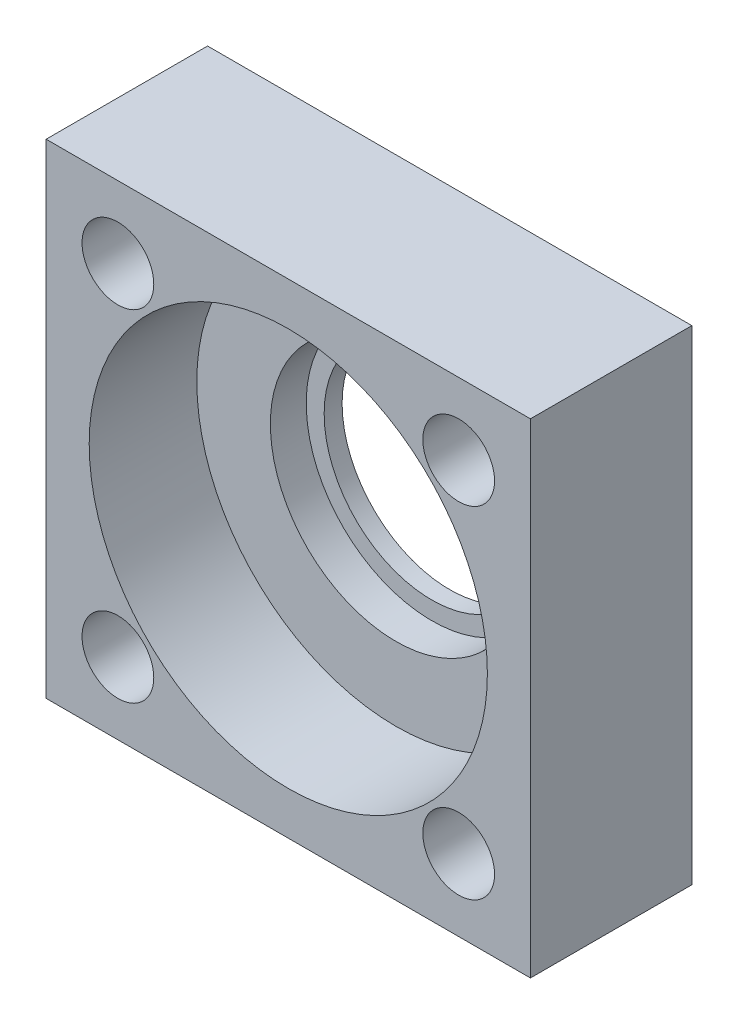
ISO-10303-21;
HEADER;
FILE_DESCRIPTION(('STEP AP214'),'2;1');
FILE_NAME('part.step','',(''),(''),'','','');
FILE_SCHEMA(('AUTOMOTIVE_DESIGN { 1 0 10303 214 1 1 1 1 }'));
ENDSEC;
DATA;
#1=APPLICATION_CONTEXT('core data for automotive mechanical design processes');
#2=APPLICATION_PROTOCOL_DEFINITION('international standard','automotive_design',2000,#1);
#3=PRODUCT_CONTEXT('',#1,'mechanical');
#4=PRODUCT('Part','Part','',(#3));
#5=PRODUCT_RELATED_PRODUCT_CATEGORY('part','',(#4));
#6=PRODUCT_DEFINITION_FORMATION('','',#4);
#7=PRODUCT_DEFINITION_CONTEXT('part definition',#1,'design');
#8=PRODUCT_DEFINITION('design','',#6,#7);
#9=PRODUCT_DEFINITION_SHAPE('','',#8);
#10=(LENGTH_UNIT() NAMED_UNIT(*) SI_UNIT(.MILLI.,.METRE.));
#11=(NAMED_UNIT(*) PLANE_ANGLE_UNIT() SI_UNIT($,.RADIAN.));
#12=(NAMED_UNIT(*) SI_UNIT($,.STERADIAN.) SOLID_ANGLE_UNIT());
#13=UNCERTAINTY_MEASURE_WITH_UNIT(LENGTH_MEASURE(1.E-05),#10,'distance_accuracy_value','');
#14=(GEOMETRIC_REPRESENTATION_CONTEXT(3) GLOBAL_UNCERTAINTY_ASSIGNED_CONTEXT((#13)) GLOBAL_UNIT_ASSIGNED_CONTEXT((#10,
#11,#12)) REPRESENTATION_CONTEXT('',''));
#15=CARTESIAN_POINT('',(0.,0.,0.));
#16=DIRECTION('',(0.,0.,1.));
#17=DIRECTION('',(1.,0.,0.));
#18=AXIS2_PLACEMENT_3D('',#15,#16,#17);
#19=CARTESIAN_POINT('',(0.,0.,0.));
#20=DIRECTION('',(0.,0.,1.));
#21=DIRECTION('',(1.,0.,0.));
#22=AXIS2_PLACEMENT_3D('',#19,#20,#21);
#23=CYLINDRICAL_SURFACE('',#22,30.);
#24=CARTESIAN_POINT('',(0.,0.,0.));
#25=DIRECTION('',(0.,0.,1.));
#26=DIRECTION('',(1.,0.,0.));
#27=AXIS2_PLACEMENT_3D('',#24,#25,#26);
#28=CIRCLE('',#27,30.);
#29=CARTESIAN_POINT('',(30.,0.,0.));
#30=VERTEX_POINT('',#29);
#31=EDGE_CURVE('E145',#30,#30,#28,.T.);
#32=CARTESIAN_POINT('',(0.,0.,5.));
#33=DIRECTION('',(0.,0.,1.));
#34=DIRECTION('',(1.,0.,0.));
#35=AXIS2_PLACEMENT_3D('',#32,#33,#34);
#36=CIRCLE('',#35,30.);
#37=CARTESIAN_POINT('',(30.,0.,5.));
#38=VERTEX_POINT('',#37);
#39=EDGE_CURVE('E49',#38,#38,#36,.F.);
#40=CARTESIAN_POINT('',(30.,0.,0.));
#41=CARTESIAN_POINT('',(30.,0.,0.0520833333333332));
#42=CARTESIAN_POINT('',(30.,0.,0.104166666666667));
#43=CARTESIAN_POINT('',(30.,0.,0.208333333333333));
#44=CARTESIAN_POINT('',(30.,0.,0.260416666666667));
#45=CARTESIAN_POINT('',(30.,0.,0.364583333333333));
#46=CARTESIAN_POINT('',(30.,0.,0.416666666666667));
#47=CARTESIAN_POINT('',(30.,0.,0.520833333333333));
#48=CARTESIAN_POINT('',(30.,0.,0.572916666666666));
#49=CARTESIAN_POINT('',(30.,0.,0.677083333333333));
#50=CARTESIAN_POINT('',(30.,0.,0.729166666666666));
#51=CARTESIAN_POINT('',(30.,0.,0.833333333333333));
#52=CARTESIAN_POINT('',(30.,0.,0.885416666666666));
#53=CARTESIAN_POINT('',(30.,0.,0.989583333333333));
#54=CARTESIAN_POINT('',(30.,0.,1.04166666666667));
#55=CARTESIAN_POINT('',(30.,0.,1.14583333333333));
#56=CARTESIAN_POINT('',(30.,0.,1.19791666666667));
#57=CARTESIAN_POINT('',(30.,0.,1.30208333333333));
#58=CARTESIAN_POINT('',(30.,0.,1.35416666666667));
#59=CARTESIAN_POINT('',(30.,0.,1.45833333333333));
#60=CARTESIAN_POINT('',(30.,0.,1.51041666666667));
#61=CARTESIAN_POINT('',(30.,0.,1.61458333333333));
#62=CARTESIAN_POINT('',(30.,0.,1.66666666666667));
#63=CARTESIAN_POINT('',(30.,0.,1.77083333333333));
#64=CARTESIAN_POINT('',(30.,0.,1.82291666666667));
#65=CARTESIAN_POINT('',(30.,0.,1.92708333333333));
#66=CARTESIAN_POINT('',(30.,0.,1.97916666666667));
#67=CARTESIAN_POINT('',(30.,0.,2.08333333333333));
#68=CARTESIAN_POINT('',(30.,0.,2.13541666666667));
#69=CARTESIAN_POINT('',(30.,0.,2.23958333333333));
#70=CARTESIAN_POINT('',(30.,0.,2.29166666666667));
#71=CARTESIAN_POINT('',(30.,0.,2.39583333333333));
#72=CARTESIAN_POINT('',(30.,0.,2.44791666666667));
#73=CARTESIAN_POINT('',(30.,0.,2.55208333333333));
#74=CARTESIAN_POINT('',(30.,0.,2.60416666666667));
#75=CARTESIAN_POINT('',(30.,0.,2.70833333333333));
#76=CARTESIAN_POINT('',(30.,0.,2.76041666666667));
#77=CARTESIAN_POINT('',(30.,0.,2.86458333333333));
#78=CARTESIAN_POINT('',(30.,0.,2.91666666666667));
#79=CARTESIAN_POINT('',(30.,0.,3.02083333333333));
#80=CARTESIAN_POINT('',(30.,0.,3.07291666666667));
#81=CARTESIAN_POINT('',(30.,0.,3.17708333333333));
#82=CARTESIAN_POINT('',(30.,0.,3.22916666666667));
#83=CARTESIAN_POINT('',(30.,0.,3.33333333333333));
#84=CARTESIAN_POINT('',(30.,0.,3.38541666666667));
#85=CARTESIAN_POINT('',(30.,0.,3.48958333333333));
#86=CARTESIAN_POINT('',(30.,0.,3.54166666666667));
#87=CARTESIAN_POINT('',(30.,0.,3.64583333333333));
#88=CARTESIAN_POINT('',(30.,0.,3.69791666666667));
#89=CARTESIAN_POINT('',(30.,0.,3.80208333333333));
#90=CARTESIAN_POINT('',(30.,0.,3.85416666666667));
#91=CARTESIAN_POINT('',(30.,0.,3.95833333333333));
#92=CARTESIAN_POINT('',(30.,0.,4.01041666666667));
#93=CARTESIAN_POINT('',(30.,0.,4.11458333333333));
#94=CARTESIAN_POINT('',(30.,0.,4.16666666666667));
#95=CARTESIAN_POINT('',(30.,0.,4.27083333333333));
#96=CARTESIAN_POINT('',(30.,0.,4.32291666666667));
#97=CARTESIAN_POINT('',(30.,0.,4.42708333333333));
#98=CARTESIAN_POINT('',(30.,0.,4.47916666666667));
#99=CARTESIAN_POINT('',(30.,0.,4.58333333333333));
#100=CARTESIAN_POINT('',(30.,0.,4.63541666666667));
#101=CARTESIAN_POINT('',(30.,0.,4.73958333333333));
#102=CARTESIAN_POINT('',(30.,0.,4.79166666666666));
#103=CARTESIAN_POINT('',(30.,0.,4.89583333333333));
#104=CARTESIAN_POINT('',(30.,0.,4.94791666666666));
#105=CARTESIAN_POINT('',(30.,0.,5.));
#106=B_SPLINE_CURVE_WITH_KNOTS('',3,(#40,#41,#42,#43,#44,#45,#46,#47,#48,#49,#50,#51,#52,#53,
#54,#55,#56,#57,#58,#59,#60,#61,#62,#63,#64,#65,#66,#67,#68,#69,#70,#71,#72,#73,#74,#75,#76,#77,
#78,#79,#80,#81,#82,#83,#84,#85,#86,#87,#88,#89,#90,#91,#92,#93,#94,#95,#96,#97,#98,#99,#100,
#101,#102,#103,#104,#105),.UNSPECIFIED.,.F.,.F.,(4,2,2,2,2,2,2,2,2,2,2,2,2,2,2,2,2,2,2,2,2,2,2,
2,2,2,2,2,2,2,2,2,4),(0.,0.15625,0.3125,0.46875,0.625,0.78125,0.9375,1.09375,1.25,1.40625,
1.5625,1.71875,1.875,2.03125,2.1875,2.34375,2.5,2.65625,2.8125,2.96875,3.125,3.28125,3.4375,
3.59375,3.75,3.90625,4.0625,4.21875,4.375,4.53125,4.6875,4.84375,5.),.UNSPECIFIED.);
#107=EDGE_CURVE('BSEAM45',#30,#38,#106,.T.);
#108=ORIENTED_EDGE('',*,*,#31,.F.);
#109=ORIENTED_EDGE('',*,*,#39,.F.);
#110=ORIENTED_EDGE('',*,*,#107,.T.);
#111=ORIENTED_EDGE('',*,*,#107,.F.);
#112=EDGE_LOOP('',(#108,#110,#109,#111));
#113=FACE_BOUND('',#112,.T.);
#114=ADVANCED_FACE('F45',(#113),#23,.F.);
#115=CARTESIAN_POINT('',(67.5,-67.5,45.));
#116=DIRECTION('',(-1.,0.,0.));
#117=DIRECTION('',(0.,0.,1.));
#118=AXIS2_PLACEMENT_3D('',#115,#116,#117);
#119=PLANE('',#118);
#120=DIRECTION('',(0.,1.,0.));
#121=VECTOR('',#120,1.);
#122=CARTESIAN_POINT('',(67.5,-67.5,0.));
#123=LINE('',#122,#121);
#124=CARTESIAN_POINT('',(67.5,-67.5,0.));
#125=VERTEX_POINT('',#124);
#126=CARTESIAN_POINT('',(67.5,67.5,0.));
#127=VERTEX_POINT('',#126);
#128=EDGE_CURVE('E116',#125,#127,#123,.T.);
#129=ORIENTED_EDGE('',*,*,#128,.T.);
#130=DIRECTION('',(0.,0.,-1.));
#131=VECTOR('',#130,1.);
#132=CARTESIAN_POINT('',(67.5,67.5,45.));
#133=LINE('',#132,#131);
#134=CARTESIAN_POINT('',(67.5,67.5,45.));
#135=VERTEX_POINT('',#134);
#136=EDGE_CURVE('E11',#135,#127,#133,.T.);
#137=ORIENTED_EDGE('',*,*,#136,.F.);
#138=DIRECTION('',(0.,1.,0.));
#139=VECTOR('',#138,1.);
#140=CARTESIAN_POINT('',(67.5,-67.5,45.));
#141=LINE('',#140,#139);
#142=CARTESIAN_POINT('',(67.5,-67.5,45.));
#143=VERTEX_POINT('',#142);
#144=EDGE_CURVE('E99',#143,#135,#141,.T.);
#145=ORIENTED_EDGE('',*,*,#144,.F.);
#146=DIRECTION('',(0.,0.,-1.));
#147=VECTOR('',#146,1.);
#148=CARTESIAN_POINT('',(67.5,-67.5,45.));
#149=LINE('',#148,#147);
#150=EDGE_CURVE('E112',#143,#125,#149,.T.);
#151=ORIENTED_EDGE('',*,*,#150,.T.);
#152=EDGE_LOOP('',(#129,#137,#145,#151));
#153=FACE_BOUND('',#152,.T.);
#154=ADVANCED_FACE('F47',(#153),#119,.F.);
#155=CARTESIAN_POINT('',(-67.5,67.5,45.));
#156=DIRECTION('',(0.,-1.,0.));
#157=DIRECTION('',(0.,0.,-1.));
#158=AXIS2_PLACEMENT_3D('',#155,#156,#157);
#159=PLANE('',#158);
#160=DIRECTION('',(-1.,0.,0.));
#161=VECTOR('',#160,1.);
#162=CARTESIAN_POINT('',(-67.5,67.5,0.));
#163=LINE('',#162,#161);
#164=CARTESIAN_POINT('',(-67.5,67.5,0.));
#165=VERTEX_POINT('',#164);
#166=EDGE_CURVE('E104',#127,#165,#163,.T.);
#167=ORIENTED_EDGE('',*,*,#166,.T.);
#168=DIRECTION('',(0.,0.,-1.));
#169=VECTOR('',#168,1.);
#170=CARTESIAN_POINT('',(-67.5,67.5,45.));
#171=LINE('',#170,#169);
#172=CARTESIAN_POINT('',(-67.5,67.5,45.));
#173=VERTEX_POINT('',#172);
#174=EDGE_CURVE('E56',#173,#165,#171,.T.);
#175=ORIENTED_EDGE('',*,*,#174,.F.);
#176=DIRECTION('',(-1.,0.,0.));
#177=VECTOR('',#176,1.);
#178=CARTESIAN_POINT('',(-67.5,67.5,45.));
#179=LINE('',#178,#177);
#180=EDGE_CURVE('E94',#135,#173,#179,.T.);
#181=ORIENTED_EDGE('',*,*,#180,.F.);
#182=ORIENTED_EDGE('',*,*,#136,.T.);
#183=EDGE_LOOP('',(#167,#175,#181,#182));
#184=FACE_BOUND('',#183,.T.);
#185=ADVANCED_FACE('F103',(#184),#159,.F.);
#186=CARTESIAN_POINT('',(-67.5,-67.5,45.));
#187=DIRECTION('',(1.,0.,0.));
#188=DIRECTION('',(0.,0.,-1.));
#189=AXIS2_PLACEMENT_3D('',#186,#187,#188);
#190=PLANE('',#189);
#191=DIRECTION('',(0.,-1.,0.));
#192=VECTOR('',#191,1.);
#193=CARTESIAN_POINT('',(-67.5,-67.5,0.));
#194=LINE('',#193,#192);
#195=CARTESIAN_POINT('',(-67.5,-67.5,0.));
#196=VERTEX_POINT('',#195);
#197=EDGE_CURVE('E81',#165,#196,#194,.T.);
#198=ORIENTED_EDGE('',*,*,#197,.T.);
#199=DIRECTION('',(0.,0.,-1.));
#200=VECTOR('',#199,1.);
#201=CARTESIAN_POINT('',(-67.5,-67.5,45.));
#202=LINE('',#201,#200);
#203=CARTESIAN_POINT('',(-67.5,-67.5,45.));
#204=VERTEX_POINT('',#203);
#205=EDGE_CURVE('E106',#204,#196,#202,.T.);
#206=ORIENTED_EDGE('',*,*,#205,.F.);
#207=DIRECTION('',(0.,-1.,0.));
#208=VECTOR('',#207,1.);
#209=CARTESIAN_POINT('',(-67.5,-67.5,45.));
#210=LINE('',#209,#208);
#211=EDGE_CURVE('E97',#173,#204,#210,.T.);
#212=ORIENTED_EDGE('',*,*,#211,.F.);
#213=ORIENTED_EDGE('',*,*,#174,.T.);
#214=EDGE_LOOP('',(#198,#206,#212,#213));
#215=FACE_BOUND('',#214,.T.);
#216=ADVANCED_FACE('F108',(#215),#190,.F.);
#217=CARTESIAN_POINT('',(-67.5,-67.5,45.));
#218=DIRECTION('',(0.,1.,0.));
#219=DIRECTION('',(0.,0.,1.));
#220=AXIS2_PLACEMENT_3D('',#217,#218,#219);
#221=PLANE('',#220);
#222=DIRECTION('',(1.,0.,0.));
#223=VECTOR('',#222,1.);
#224=CARTESIAN_POINT('',(-67.5,-67.5,0.));
#225=LINE('',#224,#223);
#226=EDGE_CURVE('E87',#196,#125,#225,.T.);
#227=ORIENTED_EDGE('',*,*,#226,.T.);
#228=ORIENTED_EDGE('',*,*,#150,.F.);
#229=DIRECTION('',(1.,0.,0.));
#230=VECTOR('',#229,1.);
#231=CARTESIAN_POINT('',(-67.5,-67.5,45.));
#232=LINE('',#231,#230);
#233=EDGE_CURVE('E64',#204,#143,#232,.T.);
#234=ORIENTED_EDGE('',*,*,#233,.F.);
#235=ORIENTED_EDGE('',*,*,#205,.T.);
#236=EDGE_LOOP('',(#227,#228,#234,#235));
#237=FACE_BOUND('',#236,.T.);
#238=ADVANCED_FACE('F130',(#237),#221,.F.);
#239=CARTESIAN_POINT('',(0.,0.,45.));
#240=DIRECTION('',(0.,0.,-1.));
#241=DIRECTION('',(-1.,0.,0.));
#242=AXIS2_PLACEMENT_3D('',#239,#240,#241);
#243=PLANE('',#242);
#244=CARTESIAN_POINT('',(0.,0.,45.));
#245=DIRECTION('',(0.,0.,1.));
#246=DIRECTION('',(1.,0.,0.));
#247=AXIS2_PLACEMENT_3D('',#244,#245,#246);
#248=CIRCLE('',#247,55.5);
#249=CARTESIAN_POINT('',(55.5,0.,45.));
#250=VERTEX_POINT('',#249);
#251=EDGE_CURVE('E173',#250,#250,#248,.T.);
#252=ORIENTED_EDGE('',*,*,#251,.F.);
#253=EDGE_LOOP('',(#252));
#254=FACE_BOUND('',#253,.T.);
#255=CARTESIAN_POINT('',(-47.5,-47.5,45.));
#256=DIRECTION('',(0.,0.,1.));
#257=DIRECTION('',(-1.,0.,0.));
#258=AXIS2_PLACEMENT_3D('',#255,#256,#257);
#259=CIRCLE('',#258,10.);
#260=CARTESIAN_POINT('',(-37.5,-47.5,45.));
#261=VERTEX_POINT('',#260);
#262=EDGE_CURVE('E154',#261,#261,#259,.T.);
#263=ORIENTED_EDGE('',*,*,#262,.F.);
#264=EDGE_LOOP('',(#263));
#265=FACE_BOUND('',#264,.T.);
#266=CARTESIAN_POINT('',(47.5,-47.5,45.));
#267=DIRECTION('',(0.,0.,1.));
#268=DIRECTION('',(1.,0.,0.));
#269=AXIS2_PLACEMENT_3D('',#266,#267,#268);
#270=CIRCLE('',#269,10.);
#271=CARTESIAN_POINT('',(57.5,-47.5,45.));
#272=VERTEX_POINT('',#271);
#273=EDGE_CURVE('E162',#272,#272,#270,.T.);
#274=ORIENTED_EDGE('',*,*,#273,.F.);
#275=EDGE_LOOP('',(#274));
#276=FACE_BOUND('',#275,.T.);
#277=CARTESIAN_POINT('',(47.5,47.5,45.));
#278=DIRECTION('',(0.,0.,1.));
#279=DIRECTION('',(-1.,0.,0.));
#280=AXIS2_PLACEMENT_3D('',#277,#278,#279);
#281=CIRCLE('',#280,10.);
#282=CARTESIAN_POINT('',(57.5,47.5,45.));
#283=VERTEX_POINT('',#282);
#284=EDGE_CURVE('E141',#283,#283,#281,.T.);
#285=ORIENTED_EDGE('',*,*,#284,.F.);
#286=EDGE_LOOP('',(#285));
#287=FACE_BOUND('',#286,.T.);
#288=CARTESIAN_POINT('',(-47.5,47.5,45.));
#289=DIRECTION('',(0.,0.,1.));
#290=DIRECTION('',(1.,0.,0.));
#291=AXIS2_PLACEMENT_3D('',#288,#289,#290);
#292=CIRCLE('',#291,10.);
#293=CARTESIAN_POINT('',(-37.5,47.5,45.));
#294=VERTEX_POINT('',#293);
#295=EDGE_CURVE('E137',#294,#294,#292,.T.);
#296=ORIENTED_EDGE('',*,*,#295,.F.);
#297=EDGE_LOOP('',(#296));
#298=FACE_BOUND('',#297,.T.);
#299=ORIENTED_EDGE('',*,*,#144,.T.);
#300=ORIENTED_EDGE('',*,*,#180,.T.);
#301=ORIENTED_EDGE('',*,*,#211,.T.);
#302=ORIENTED_EDGE('',*,*,#233,.T.);
#303=EDGE_LOOP('',(#299,#300,#301,#302));
#304=FACE_BOUND('',#303,.T.);
#305=ADVANCED_FACE('F95',(#254,#265,#276,#287,#298,#304),#243,.F.);
#306=CARTESIAN_POINT('',(0.,0.,0.));
#307=DIRECTION('',(0.,0.,-1.));
#308=DIRECTION('',(-1.,0.,0.));
#309=AXIS2_PLACEMENT_3D('',#306,#307,#308);
#310=PLANE('',#309);
#311=ORIENTED_EDGE('',*,*,#31,.T.);
#312=EDGE_LOOP('',(#311));
#313=FACE_BOUND('',#312,.T.);
#314=CARTESIAN_POINT('',(-47.5,-47.5,0.));
#315=DIRECTION('',(0.,0.,1.));
#316=DIRECTION('',(-1.,0.,0.));
#317=AXIS2_PLACEMENT_3D('',#314,#315,#316);
#318=CIRCLE('',#317,10.);
#319=CARTESIAN_POINT('',(-37.5,-47.5,0.));
#320=VERTEX_POINT('',#319);
#321=EDGE_CURVE('E149',#320,#320,#318,.T.);
#322=ORIENTED_EDGE('',*,*,#321,.T.);
#323=EDGE_LOOP('',(#322));
#324=FACE_BOUND('',#323,.T.);
#325=CARTESIAN_POINT('',(47.5,-47.5,0.));
#326=DIRECTION('',(0.,0.,1.));
#327=DIRECTION('',(1.,0.,0.));
#328=AXIS2_PLACEMENT_3D('',#325,#326,#327);
#329=CIRCLE('',#328,10.);
#330=CARTESIAN_POINT('',(57.5,-47.5,0.));
#331=VERTEX_POINT('',#330);
#332=EDGE_CURVE('E158',#331,#331,#329,.T.);
#333=ORIENTED_EDGE('',*,*,#332,.T.);
#334=EDGE_LOOP('',(#333));
#335=FACE_BOUND('',#334,.T.);
#336=CARTESIAN_POINT('',(47.5,47.5,0.));
#337=DIRECTION('',(0.,0.,1.));
#338=DIRECTION('',(-1.,0.,0.));
#339=AXIS2_PLACEMENT_3D('',#336,#337,#338);
#340=CIRCLE('',#339,10.);
#341=CARTESIAN_POINT('',(57.5,47.5,0.));
#342=VERTEX_POINT('',#341);
#343=EDGE_CURVE('E166',#342,#342,#340,.T.);
#344=ORIENTED_EDGE('',*,*,#343,.T.);
#345=EDGE_LOOP('',(#344));
#346=FACE_BOUND('',#345,.T.);
#347=CARTESIAN_POINT('',(-47.5,47.5,0.));
#348=DIRECTION('',(0.,0.,1.));
#349=DIRECTION('',(1.,0.,0.));
#350=AXIS2_PLACEMENT_3D('',#347,#348,#349);
#351=CIRCLE('',#350,10.);
#352=CARTESIAN_POINT('',(-37.5,47.5,0.));
#353=VERTEX_POINT('',#352);
#354=EDGE_CURVE('E120',#353,#353,#351,.T.);
#355=ORIENTED_EDGE('',*,*,#354,.T.);
#356=EDGE_LOOP('',(#355));
#357=FACE_BOUND('',#356,.T.);
#358=ORIENTED_EDGE('',*,*,#128,.F.);
#359=ORIENTED_EDGE('',*,*,#226,.F.);
#360=ORIENTED_EDGE('',*,*,#197,.F.);
#361=ORIENTED_EDGE('',*,*,#166,.F.);
#362=EDGE_LOOP('',(#358,#359,#360,#361));
#363=FACE_BOUND('',#362,.T.);
#364=ADVANCED_FACE('F133',(#313,#324,#335,#346,#357,#363),#310,.T.);
#365=CARTESIAN_POINT('',(-47.5,47.5,0.));
#366=DIRECTION('',(0.,0.,1.));
#367=DIRECTION('',(1.,0.,0.));
#368=AXIS2_PLACEMENT_3D('',#365,#366,#367);
#369=CYLINDRICAL_SURFACE('',#368,10.);
#370=CARTESIAN_POINT('',(-37.5,47.5,0.));
#371=CARTESIAN_POINT('',(-37.5,47.5,0.468749999999999));
#372=CARTESIAN_POINT('',(-37.5,47.5,0.9375));
#373=CARTESIAN_POINT('',(-37.5,47.5,1.875));
#374=CARTESIAN_POINT('',(-37.5,47.5,2.34375));
#375=CARTESIAN_POINT('',(-37.5,47.5,3.28125));
#376=CARTESIAN_POINT('',(-37.5,47.5,3.75));
#377=CARTESIAN_POINT('',(-37.5,47.5,4.6875));
#378=CARTESIAN_POINT('',(-37.5,47.5,5.15625));
#379=CARTESIAN_POINT('',(-37.5,47.5,6.09375));
#380=CARTESIAN_POINT('',(-37.5,47.5,6.5625));
#381=CARTESIAN_POINT('',(-37.5,47.5,7.5));
#382=CARTESIAN_POINT('',(-37.5,47.5,7.96875));
#383=CARTESIAN_POINT('',(-37.5,47.5,8.90625));
#384=CARTESIAN_POINT('',(-37.5,47.5,9.375));
#385=CARTESIAN_POINT('',(-37.5,47.5,10.3125));
#386=CARTESIAN_POINT('',(-37.5,47.5,10.78125));
#387=CARTESIAN_POINT('',(-37.5,47.5,11.71875));
#388=CARTESIAN_POINT('',(-37.5,47.5,12.1875));
#389=CARTESIAN_POINT('',(-37.5,47.5,13.125));
#390=CARTESIAN_POINT('',(-37.5,47.5,13.59375));
#391=CARTESIAN_POINT('',(-37.5,47.5,14.53125));
#392=CARTESIAN_POINT('',(-37.5,47.5,15.));
#393=CARTESIAN_POINT('',(-37.5,47.5,15.9375));
#394=CARTESIAN_POINT('',(-37.5,47.5,16.40625));
#395=CARTESIAN_POINT('',(-37.5,47.5,17.34375));
#396=CARTESIAN_POINT('',(-37.5,47.5,17.8125));
#397=CARTESIAN_POINT('',(-37.5,47.5,18.75));
#398=CARTESIAN_POINT('',(-37.5,47.5,19.21875));
#399=CARTESIAN_POINT('',(-37.5,47.5,20.15625));
#400=CARTESIAN_POINT('',(-37.5,47.5,20.625));
#401=CARTESIAN_POINT('',(-37.5,47.5,21.5625));
#402=CARTESIAN_POINT('',(-37.5,47.5,22.03125));
#403=CARTESIAN_POINT('',(-37.5,47.5,22.96875));
#404=CARTESIAN_POINT('',(-37.5,47.5,23.4375));
#405=CARTESIAN_POINT('',(-37.5,47.5,24.375));
#406=CARTESIAN_POINT('',(-37.5,47.5,24.84375));
#407=CARTESIAN_POINT('',(-37.5,47.5,25.78125));
#408=CARTESIAN_POINT('',(-37.5,47.5,26.25));
#409=CARTESIAN_POINT('',(-37.5,47.5,27.1875));
#410=CARTESIAN_POINT('',(-37.5,47.5,27.65625));
#411=CARTESIAN_POINT('',(-37.5,47.5,28.59375));
#412=CARTESIAN_POINT('',(-37.5,47.5,29.0625));
#413=CARTESIAN_POINT('',(-37.5,47.5,30.));
#414=CARTESIAN_POINT('',(-37.5,47.5,30.46875));
#415=CARTESIAN_POINT('',(-37.5,47.5,31.40625));
#416=CARTESIAN_POINT('',(-37.5,47.5,31.875));
#417=CARTESIAN_POINT('',(-37.5,47.5,32.8125));
#418=CARTESIAN_POINT('',(-37.5,47.5,33.28125));
#419=CARTESIAN_POINT('',(-37.5,47.5,34.21875));
#420=CARTESIAN_POINT('',(-37.5,47.5,34.6875));
#421=CARTESIAN_POINT('',(-37.5,47.5,35.625));
#422=CARTESIAN_POINT('',(-37.5,47.5,36.09375));
#423=CARTESIAN_POINT('',(-37.5,47.5,37.03125));
#424=CARTESIAN_POINT('',(-37.5,47.5,37.5));
#425=CARTESIAN_POINT('',(-37.5,47.5,38.4375));
#426=CARTESIAN_POINT('',(-37.5,47.5,38.90625));
#427=CARTESIAN_POINT('',(-37.5,47.5,39.84375));
#428=CARTESIAN_POINT('',(-37.5,47.5,40.3125));
#429=CARTESIAN_POINT('',(-37.5,47.5,41.25));
#430=CARTESIAN_POINT('',(-37.5,47.5,41.71875));
#431=CARTESIAN_POINT('',(-37.5,47.5,42.65625));
#432=CARTESIAN_POINT('',(-37.5,47.5,43.125));
#433=CARTESIAN_POINT('',(-37.5,47.5,44.0625));
#434=CARTESIAN_POINT('',(-37.5,47.5,44.53125));
#435=CARTESIAN_POINT('',(-37.5,47.5,45.));
#436=B_SPLINE_CURVE_WITH_KNOTS('',3,(#370,#371,#372,#373,#374,#375,#376,#377,#378,#379,#380,
#381,#382,#383,#384,#385,#386,#387,#388,#389,#390,#391,#392,#393,#394,#395,#396,#397,#398,#399,
#400,#401,#402,#403,#404,#405,#406,#407,#408,#409,#410,#411,#412,#413,#414,#415,#416,#417,#418,
#419,#420,#421,#422,#423,#424,#425,#426,#427,#428,#429,#430,#431,#432,#433,#434,#435),
.UNSPECIFIED.,.F.,.F.,(4,2,2,2,2,2,2,2,2,2,2,2,2,2,2,2,2,2,2,2,2,2,2,2,2,2,2,2,2,2,2,2,4),(0.,
1.40625,2.8125,4.21875,5.625,7.03125,8.4375,9.84375,11.25,12.65625,14.0625,15.46875,16.875,
18.28125,19.6875,21.09375,22.5,23.90625,25.3125,26.71875,28.125,29.53125,30.9375,32.34375,33.75,
35.15625,36.5625,37.96875,39.375,40.78125,42.1875,43.59375,45.),.UNSPECIFIED.);
#437=EDGE_CURVE('BSEAM208',#353,#294,#436,.T.);
#438=ORIENTED_EDGE('',*,*,#354,.F.);
#439=ORIENTED_EDGE('',*,*,#295,.T.);
#440=ORIENTED_EDGE('',*,*,#437,.T.);
#441=ORIENTED_EDGE('',*,*,#437,.F.);
#442=EDGE_LOOP('',(#438,#440,#439,#441));
#443=FACE_BOUND('',#442,.T.);
#444=ADVANCED_FACE('F208',(#443),#369,.F.);
#445=CARTESIAN_POINT('',(47.5,47.5,0.));
#446=DIRECTION('',(0.,0.,1.));
#447=DIRECTION('',(1.,0.,0.));
#448=AXIS2_PLACEMENT_3D('',#445,#446,#447);
#449=CYLINDRICAL_SURFACE('',#448,10.);
#450=CARTESIAN_POINT('',(57.5,47.5,0.));
#451=CARTESIAN_POINT('',(57.5,47.5,0.468749999999999));
#452=CARTESIAN_POINT('',(57.5,47.5,0.9375));
#453=CARTESIAN_POINT('',(57.5,47.5,1.875));
#454=CARTESIAN_POINT('',(57.5,47.5,2.34375));
#455=CARTESIAN_POINT('',(57.5,47.5,3.28125));
#456=CARTESIAN_POINT('',(57.5,47.5,3.75));
#457=CARTESIAN_POINT('',(57.5,47.5,4.6875));
#458=CARTESIAN_POINT('',(57.5,47.5,5.15625));
#459=CARTESIAN_POINT('',(57.5,47.5,6.09375));
#460=CARTESIAN_POINT('',(57.5,47.5,6.5625));
#461=CARTESIAN_POINT('',(57.5,47.5,7.5));
#462=CARTESIAN_POINT('',(57.5,47.5,7.96875));
#463=CARTESIAN_POINT('',(57.5,47.5,8.90625));
#464=CARTESIAN_POINT('',(57.5,47.5,9.375));
#465=CARTESIAN_POINT('',(57.5,47.5,10.3125));
#466=CARTESIAN_POINT('',(57.5,47.5,10.78125));
#467=CARTESIAN_POINT('',(57.5,47.5,11.71875));
#468=CARTESIAN_POINT('',(57.5,47.5,12.1875));
#469=CARTESIAN_POINT('',(57.5,47.5,13.125));
#470=CARTESIAN_POINT('',(57.5,47.5,13.59375));
#471=CARTESIAN_POINT('',(57.5,47.5,14.53125));
#472=CARTESIAN_POINT('',(57.5,47.5,15.));
#473=CARTESIAN_POINT('',(57.5,47.5,15.9375));
#474=CARTESIAN_POINT('',(57.5,47.5,16.40625));
#475=CARTESIAN_POINT('',(57.5,47.5,17.34375));
#476=CARTESIAN_POINT('',(57.5,47.5,17.8125));
#477=CARTESIAN_POINT('',(57.5,47.5,18.75));
#478=CARTESIAN_POINT('',(57.5,47.5,19.21875));
#479=CARTESIAN_POINT('',(57.5,47.5,20.15625));
#480=CARTESIAN_POINT('',(57.5,47.5,20.625));
#481=CARTESIAN_POINT('',(57.5,47.5,21.5625));
#482=CARTESIAN_POINT('',(57.5,47.5,22.03125));
#483=CARTESIAN_POINT('',(57.5,47.5,22.96875));
#484=CARTESIAN_POINT('',(57.5,47.5,23.4375));
#485=CARTESIAN_POINT('',(57.5,47.5,24.375));
#486=CARTESIAN_POINT('',(57.5,47.5,24.84375));
#487=CARTESIAN_POINT('',(57.5,47.5,25.78125));
#488=CARTESIAN_POINT('',(57.5,47.5,26.25));
#489=CARTESIAN_POINT('',(57.5,47.5,27.1875));
#490=CARTESIAN_POINT('',(57.5,47.5,27.65625));
#491=CARTESIAN_POINT('',(57.5,47.5,28.59375));
#492=CARTESIAN_POINT('',(57.5,47.5,29.0625));
#493=CARTESIAN_POINT('',(57.5,47.5,30.));
#494=CARTESIAN_POINT('',(57.5,47.5,30.46875));
#495=CARTESIAN_POINT('',(57.5,47.5,31.40625));
#496=CARTESIAN_POINT('',(57.5,47.5,31.875));
#497=CARTESIAN_POINT('',(57.5,47.5,32.8125));
#498=CARTESIAN_POINT('',(57.5,47.5,33.28125));
#499=CARTESIAN_POINT('',(57.5,47.5,34.21875));
#500=CARTESIAN_POINT('',(57.5,47.5,34.6875));
#501=CARTESIAN_POINT('',(57.5,47.5,35.625));
#502=CARTESIAN_POINT('',(57.5,47.5,36.09375));
#503=CARTESIAN_POINT('',(57.5,47.5,37.03125));
#504=CARTESIAN_POINT('',(57.5,47.5,37.5));
#505=CARTESIAN_POINT('',(57.5,47.5,38.4375));
#506=CARTESIAN_POINT('',(57.5,47.5,38.90625));
#507=CARTESIAN_POINT('',(57.5,47.5,39.84375));
#508=CARTESIAN_POINT('',(57.5,47.5,40.3125));
#509=CARTESIAN_POINT('',(57.5,47.5,41.25));
#510=CARTESIAN_POINT('',(57.5,47.5,41.71875));
#511=CARTESIAN_POINT('',(57.5,47.5,42.65625));
#512=CARTESIAN_POINT('',(57.5,47.5,43.125));
#513=CARTESIAN_POINT('',(57.5,47.5,44.0625));
#514=CARTESIAN_POINT('',(57.5,47.5,44.53125));
#515=CARTESIAN_POINT('',(57.5,47.5,45.));
#516=B_SPLINE_CURVE_WITH_KNOTS('',3,(#450,#451,#452,#453,#454,#455,#456,#457,#458,#459,#460,
#461,#462,#463,#464,#465,#466,#467,#468,#469,#470,#471,#472,#473,#474,#475,#476,#477,#478,#479,
#480,#481,#482,#483,#484,#485,#486,#487,#488,#489,#490,#491,#492,#493,#494,#495,#496,#497,#498,
#499,#500,#501,#502,#503,#504,#505,#506,#507,#508,#509,#510,#511,#512,#513,#514,#515),
.UNSPECIFIED.,.F.,.F.,(4,2,2,2,2,2,2,2,2,2,2,2,2,2,2,2,2,2,2,2,2,2,2,2,2,2,2,2,2,2,2,2,4),(0.,
1.40625,2.8125,4.21875,5.625,7.03125,8.4375,9.84375,11.25,12.65625,14.0625,15.46875,16.875,
18.28125,19.6875,21.09375,22.5,23.90625,25.3125,26.71875,28.125,29.53125,30.9375,32.34375,33.75,
35.15625,36.5625,37.96875,39.375,40.78125,42.1875,43.59375,45.),.UNSPECIFIED.);
#517=EDGE_CURVE('BSEAM211',#342,#283,#516,.T.);
#518=ORIENTED_EDGE('',*,*,#343,.F.);
#519=ORIENTED_EDGE('',*,*,#284,.T.);
#520=ORIENTED_EDGE('',*,*,#517,.T.);
#521=ORIENTED_EDGE('',*,*,#517,.F.);
#522=EDGE_LOOP('',(#518,#520,#519,#521));
#523=FACE_BOUND('',#522,.T.);
#524=ADVANCED_FACE('F211',(#523),#449,.F.);
#525=CARTESIAN_POINT('',(47.5,-47.5,0.));
#526=DIRECTION('',(0.,0.,1.));
#527=DIRECTION('',(1.,0.,0.));
#528=AXIS2_PLACEMENT_3D('',#525,#526,#527);
#529=CYLINDRICAL_SURFACE('',#528,10.);
#530=CARTESIAN_POINT('',(57.5,-47.5,0.));
#531=CARTESIAN_POINT('',(57.5,-47.5,0.468749999999999));
#532=CARTESIAN_POINT('',(57.5,-47.5,0.9375));
#533=CARTESIAN_POINT('',(57.5,-47.5,1.875));
#534=CARTESIAN_POINT('',(57.5,-47.5,2.34375));
#535=CARTESIAN_POINT('',(57.5,-47.5,3.28125));
#536=CARTESIAN_POINT('',(57.5,-47.5,3.75));
#537=CARTESIAN_POINT('',(57.5,-47.5,4.6875));
#538=CARTESIAN_POINT('',(57.5,-47.5,5.15625));
#539=CARTESIAN_POINT('',(57.5,-47.5,6.09375));
#540=CARTESIAN_POINT('',(57.5,-47.5,6.5625));
#541=CARTESIAN_POINT('',(57.5,-47.5,7.5));
#542=CARTESIAN_POINT('',(57.5,-47.5,7.96875));
#543=CARTESIAN_POINT('',(57.5,-47.5,8.90625));
#544=CARTESIAN_POINT('',(57.5,-47.5,9.375));
#545=CARTESIAN_POINT('',(57.5,-47.5,10.3125));
#546=CARTESIAN_POINT('',(57.5,-47.5,10.78125));
#547=CARTESIAN_POINT('',(57.5,-47.5,11.71875));
#548=CARTESIAN_POINT('',(57.5,-47.5,12.1875));
#549=CARTESIAN_POINT('',(57.5,-47.5,13.125));
#550=CARTESIAN_POINT('',(57.5,-47.5,13.59375));
#551=CARTESIAN_POINT('',(57.5,-47.5,14.53125));
#552=CARTESIAN_POINT('',(57.5,-47.5,15.));
#553=CARTESIAN_POINT('',(57.5,-47.5,15.9375));
#554=CARTESIAN_POINT('',(57.5,-47.5,16.40625));
#555=CARTESIAN_POINT('',(57.5,-47.5,17.34375));
#556=CARTESIAN_POINT('',(57.5,-47.5,17.8125));
#557=CARTESIAN_POINT('',(57.5,-47.5,18.75));
#558=CARTESIAN_POINT('',(57.5,-47.5,19.21875));
#559=CARTESIAN_POINT('',(57.5,-47.5,20.15625));
#560=CARTESIAN_POINT('',(57.5,-47.5,20.625));
#561=CARTESIAN_POINT('',(57.5,-47.5,21.5625));
#562=CARTESIAN_POINT('',(57.5,-47.5,22.03125));
#563=CARTESIAN_POINT('',(57.5,-47.5,22.96875));
#564=CARTESIAN_POINT('',(57.5,-47.5,23.4375));
#565=CARTESIAN_POINT('',(57.5,-47.5,24.375));
#566=CARTESIAN_POINT('',(57.5,-47.5,24.84375));
#567=CARTESIAN_POINT('',(57.5,-47.5,25.78125));
#568=CARTESIAN_POINT('',(57.5,-47.5,26.25));
#569=CARTESIAN_POINT('',(57.5,-47.5,27.1875));
#570=CARTESIAN_POINT('',(57.5,-47.5,27.65625));
#571=CARTESIAN_POINT('',(57.5,-47.5,28.59375));
#572=CARTESIAN_POINT('',(57.5,-47.5,29.0625));
#573=CARTESIAN_POINT('',(57.5,-47.5,30.));
#574=CARTESIAN_POINT('',(57.5,-47.5,30.46875));
#575=CARTESIAN_POINT('',(57.5,-47.5,31.40625));
#576=CARTESIAN_POINT('',(57.5,-47.5,31.875));
#577=CARTESIAN_POINT('',(57.5,-47.5,32.8125));
#578=CARTESIAN_POINT('',(57.5,-47.5,33.28125));
#579=CARTESIAN_POINT('',(57.5,-47.5,34.21875));
#580=CARTESIAN_POINT('',(57.5,-47.5,34.6875));
#581=CARTESIAN_POINT('',(57.5,-47.5,35.625));
#582=CARTESIAN_POINT('',(57.5,-47.5,36.09375));
#583=CARTESIAN_POINT('',(57.5,-47.5,37.03125));
#584=CARTESIAN_POINT('',(57.5,-47.5,37.5));
#585=CARTESIAN_POINT('',(57.5,-47.5,38.4375));
#586=CARTESIAN_POINT('',(57.5,-47.5,38.90625));
#587=CARTESIAN_POINT('',(57.5,-47.5,39.84375));
#588=CARTESIAN_POINT('',(57.5,-47.5,40.3125));
#589=CARTESIAN_POINT('',(57.5,-47.5,41.25));
#590=CARTESIAN_POINT('',(57.5,-47.5,41.71875));
#591=CARTESIAN_POINT('',(57.5,-47.5,42.65625));
#592=CARTESIAN_POINT('',(57.5,-47.5,43.125));
#593=CARTESIAN_POINT('',(57.5,-47.5,44.0625));
#594=CARTESIAN_POINT('',(57.5,-47.5,44.53125));
#595=CARTESIAN_POINT('',(57.5,-47.5,45.));
#596=B_SPLINE_CURVE_WITH_KNOTS('',3,(#530,#531,#532,#533,#534,#535,#536,#537,#538,#539,#540,
#541,#542,#543,#544,#545,#546,#547,#548,#549,#550,#551,#552,#553,#554,#555,#556,#557,#558,#559,
#560,#561,#562,#563,#564,#565,#566,#567,#568,#569,#570,#571,#572,#573,#574,#575,#576,#577,#578,
#579,#580,#581,#582,#583,#584,#585,#586,#587,#588,#589,#590,#591,#592,#593,#594,#595),
.UNSPECIFIED.,.F.,.F.,(4,2,2,2,2,2,2,2,2,2,2,2,2,2,2,2,2,2,2,2,2,2,2,2,2,2,2,2,2,2,2,2,4),(0.,
1.40625,2.8125,4.21875,5.625,7.03125,8.4375,9.84375,11.25,12.65625,14.0625,15.46875,16.875,
18.28125,19.6875,21.09375,22.5,23.90625,25.3125,26.71875,28.125,29.53125,30.9375,32.34375,33.75,
35.15625,36.5625,37.96875,39.375,40.78125,42.1875,43.59375,45.),.UNSPECIFIED.);
#597=EDGE_CURVE('BSEAM255',#331,#272,#596,.T.);
#598=ORIENTED_EDGE('',*,*,#332,.F.);
#599=ORIENTED_EDGE('',*,*,#273,.T.);
#600=ORIENTED_EDGE('',*,*,#597,.T.);
#601=ORIENTED_EDGE('',*,*,#597,.F.);
#602=EDGE_LOOP('',(#598,#600,#599,#601));
#603=FACE_BOUND('',#602,.T.);
#604=ADVANCED_FACE('F255',(#603),#529,.F.);
#605=CARTESIAN_POINT('',(-47.5,-47.5,0.));
#606=DIRECTION('',(0.,0.,1.));
#607=DIRECTION('',(1.,0.,0.));
#608=AXIS2_PLACEMENT_3D('',#605,#606,#607);
#609=CYLINDRICAL_SURFACE('',#608,10.);
#610=CARTESIAN_POINT('',(-37.5,-47.5,0.));
#611=CARTESIAN_POINT('',(-37.5,-47.5,0.468749999999999));
#612=CARTESIAN_POINT('',(-37.5,-47.5,0.9375));
#613=CARTESIAN_POINT('',(-37.5,-47.5,1.875));
#614=CARTESIAN_POINT('',(-37.5,-47.5,2.34375));
#615=CARTESIAN_POINT('',(-37.5,-47.5,3.28125));
#616=CARTESIAN_POINT('',(-37.5,-47.5,3.75));
#617=CARTESIAN_POINT('',(-37.5,-47.5,4.6875));
#618=CARTESIAN_POINT('',(-37.5,-47.5,5.15625));
#619=CARTESIAN_POINT('',(-37.5,-47.5,6.09375));
#620=CARTESIAN_POINT('',(-37.5,-47.5,6.5625));
#621=CARTESIAN_POINT('',(-37.5,-47.5,7.5));
#622=CARTESIAN_POINT('',(-37.5,-47.5,7.96875));
#623=CARTESIAN_POINT('',(-37.5,-47.5,8.90625));
#624=CARTESIAN_POINT('',(-37.5,-47.5,9.375));
#625=CARTESIAN_POINT('',(-37.5,-47.5,10.3125));
#626=CARTESIAN_POINT('',(-37.5,-47.5,10.78125));
#627=CARTESIAN_POINT('',(-37.5,-47.5,11.71875));
#628=CARTESIAN_POINT('',(-37.5,-47.5,12.1875));
#629=CARTESIAN_POINT('',(-37.5,-47.5,13.125));
#630=CARTESIAN_POINT('',(-37.5,-47.5,13.59375));
#631=CARTESIAN_POINT('',(-37.5,-47.5,14.53125));
#632=CARTESIAN_POINT('',(-37.5,-47.5,15.));
#633=CARTESIAN_POINT('',(-37.5,-47.5,15.9375));
#634=CARTESIAN_POINT('',(-37.5,-47.5,16.40625));
#635=CARTESIAN_POINT('',(-37.5,-47.5,17.34375));
#636=CARTESIAN_POINT('',(-37.5,-47.5,17.8125));
#637=CARTESIAN_POINT('',(-37.5,-47.5,18.75));
#638=CARTESIAN_POINT('',(-37.5,-47.5,19.21875));
#639=CARTESIAN_POINT('',(-37.5,-47.5,20.15625));
#640=CARTESIAN_POINT('',(-37.5,-47.5,20.625));
#641=CARTESIAN_POINT('',(-37.5,-47.5,21.5625));
#642=CARTESIAN_POINT('',(-37.5,-47.5,22.03125));
#643=CARTESIAN_POINT('',(-37.5,-47.5,22.96875));
#644=CARTESIAN_POINT('',(-37.5,-47.5,23.4375));
#645=CARTESIAN_POINT('',(-37.5,-47.5,24.375));
#646=CARTESIAN_POINT('',(-37.5,-47.5,24.84375));
#647=CARTESIAN_POINT('',(-37.5,-47.5,25.78125));
#648=CARTESIAN_POINT('',(-37.5,-47.5,26.25));
#649=CARTESIAN_POINT('',(-37.5,-47.5,27.1875));
#650=CARTESIAN_POINT('',(-37.5,-47.5,27.65625));
#651=CARTESIAN_POINT('',(-37.5,-47.5,28.59375));
#652=CARTESIAN_POINT('',(-37.5,-47.5,29.0625));
#653=CARTESIAN_POINT('',(-37.5,-47.5,30.));
#654=CARTESIAN_POINT('',(-37.5,-47.5,30.46875));
#655=CARTESIAN_POINT('',(-37.5,-47.5,31.40625));
#656=CARTESIAN_POINT('',(-37.5,-47.5,31.875));
#657=CARTESIAN_POINT('',(-37.5,-47.5,32.8125));
#658=CARTESIAN_POINT('',(-37.5,-47.5,33.28125));
#659=CARTESIAN_POINT('',(-37.5,-47.5,34.21875));
#660=CARTESIAN_POINT('',(-37.5,-47.5,34.6875));
#661=CARTESIAN_POINT('',(-37.5,-47.5,35.625));
#662=CARTESIAN_POINT('',(-37.5,-47.5,36.09375));
#663=CARTESIAN_POINT('',(-37.5,-47.5,37.03125));
#664=CARTESIAN_POINT('',(-37.5,-47.5,37.5));
#665=CARTESIAN_POINT('',(-37.5,-47.5,38.4375));
#666=CARTESIAN_POINT('',(-37.5,-47.5,38.90625));
#667=CARTESIAN_POINT('',(-37.5,-47.5,39.84375));
#668=CARTESIAN_POINT('',(-37.5,-47.5,40.3125));
#669=CARTESIAN_POINT('',(-37.5,-47.5,41.25));
#670=CARTESIAN_POINT('',(-37.5,-47.5,41.71875));
#671=CARTESIAN_POINT('',(-37.5,-47.5,42.65625));
#672=CARTESIAN_POINT('',(-37.5,-47.5,43.125));
#673=CARTESIAN_POINT('',(-37.5,-47.5,44.0625));
#674=CARTESIAN_POINT('',(-37.5,-47.5,44.53125));
#675=CARTESIAN_POINT('',(-37.5,-47.5,45.));
#676=B_SPLINE_CURVE_WITH_KNOTS('',3,(#610,#611,#612,#613,#614,#615,#616,#617,#618,#619,#620,
#621,#622,#623,#624,#625,#626,#627,#628,#629,#630,#631,#632,#633,#634,#635,#636,#637,#638,#639,
#640,#641,#642,#643,#644,#645,#646,#647,#648,#649,#650,#651,#652,#653,#654,#655,#656,#657,#658,
#659,#660,#661,#662,#663,#664,#665,#666,#667,#668,#669,#670,#671,#672,#673,#674,#675),
.UNSPECIFIED.,.F.,.F.,(4,2,2,2,2,2,2,2,2,2,2,2,2,2,2,2,2,2,2,2,2,2,2,2,2,2,2,2,2,2,2,2,4),(0.,
1.40625,2.8125,4.21875,5.625,7.03125,8.4375,9.84375,11.25,12.65625,14.0625,15.46875,16.875,
18.28125,19.6875,21.09375,22.5,23.90625,25.3125,26.71875,28.125,29.53125,30.9375,32.34375,33.75,
35.15625,36.5625,37.96875,39.375,40.78125,42.1875,43.59375,45.),.UNSPECIFIED.);
#677=EDGE_CURVE('BSEAM206',#320,#261,#676,.T.);
#678=ORIENTED_EDGE('',*,*,#321,.F.);
#679=ORIENTED_EDGE('',*,*,#262,.T.);
#680=ORIENTED_EDGE('',*,*,#677,.T.);
#681=ORIENTED_EDGE('',*,*,#677,.F.);
#682=EDGE_LOOP('',(#678,#680,#679,#681));
#683=FACE_BOUND('',#682,.T.);
#684=ADVANCED_FACE('F206',(#683),#609,.F.);
#685=CARTESIAN_POINT('',(0.,0.,15.));
#686=DIRECTION('',(0.,0.,1.));
#687=DIRECTION('',(1.,0.,0.));
#688=AXIS2_PLACEMENT_3D('',#685,#686,#687);
#689=PLANE('',#688);
#690=CARTESIAN_POINT('',(0.,0.,15.));
#691=DIRECTION('',(0.,0.,1.));
#692=DIRECTION('',(1.,0.,0.));
#693=AXIS2_PLACEMENT_3D('',#690,#691,#692);
#694=CIRCLE('',#693,35.);
#695=CARTESIAN_POINT('',(35.,0.,15.));
#696=VERTEX_POINT('',#695);
#697=EDGE_CURVE('E180',#696,#696,#694,.T.);
#698=ORIENTED_EDGE('',*,*,#697,.F.);
#699=EDGE_LOOP('',(#698));
#700=FACE_BOUND('',#699,.T.);
#701=CARTESIAN_POINT('',(0.,0.,15.));
#702=DIRECTION('',(0.,0.,1.));
#703=DIRECTION('',(1.,0.,0.));
#704=AXIS2_PLACEMENT_3D('',#701,#702,#703);
#705=CIRCLE('',#704,55.5);
#706=CARTESIAN_POINT('',(55.5,0.,15.));
#707=VERTEX_POINT('',#706);
#708=EDGE_CURVE('E150',#707,#707,#705,.T.);
#709=ORIENTED_EDGE('',*,*,#708,.T.);
#710=EDGE_LOOP('',(#709));
#711=FACE_BOUND('',#710,.T.);
#712=ADVANCED_FACE('F270',(#700,#711),#689,.T.);
#713=CARTESIAN_POINT('',(0.,0.,15.));
#714=DIRECTION('',(0.,0.,1.));
#715=DIRECTION('',(1.,0.,0.));
#716=AXIS2_PLACEMENT_3D('',#713,#714,#715);
#717=CYLINDRICAL_SURFACE('',#716,55.5);
#718=ORIENTED_EDGE('',*,*,#708,.F.);
#719=EDGE_LOOP('',(#718));
#720=FACE_BOUND('',#719,.T.);
#721=ORIENTED_EDGE('',*,*,#251,.T.);
#722=EDGE_LOOP('',(#721));
#723=FACE_BOUND('',#722,.T.);
#724=ADVANCED_FACE('F280',(#720,#723),#717,.F.);
#725=CARTESIAN_POINT('',(0.,0.,5.));
#726=DIRECTION('',(0.,0.,1.));
#727=DIRECTION('',(1.,0.,0.));
#728=AXIS2_PLACEMENT_3D('',#725,#726,#727);
#729=PLANE('',#728);
#730=CARTESIAN_POINT('',(0.,0.,5.));
#731=DIRECTION('',(0.,0.,1.));
#732=DIRECTION('',(1.,0.,0.));
#733=AXIS2_PLACEMENT_3D('',#730,#731,#732);
#734=CIRCLE('',#733,35.);
#735=CARTESIAN_POINT('',(35.,0.,5.));
#736=VERTEX_POINT('',#735);
#737=EDGE_CURVE('E184',#736,#736,#734,.T.);
#738=ORIENTED_EDGE('',*,*,#737,.T.);
#739=EDGE_LOOP('',(#738));
#740=FACE_BOUND('',#739,.T.);
#741=ORIENTED_EDGE('',*,*,#39,.T.);
#742=EDGE_LOOP('',(#741));
#743=FACE_BOUND('',#742,.T.);
#744=ADVANCED_FACE('F193',(#740,#743),#729,.T.);
#745=CARTESIAN_POINT('',(0.,0.,5.));
#746=DIRECTION('',(0.,0.,1.));
#747=DIRECTION('',(1.,0.,0.));
#748=AXIS2_PLACEMENT_3D('',#745,#746,#747);
#749=CYLINDRICAL_SURFACE('',#748,35.);
#750=ORIENTED_EDGE('',*,*,#737,.F.);
#751=EDGE_LOOP('',(#750));
#752=FACE_BOUND('',#751,.T.);
#753=ORIENTED_EDGE('',*,*,#697,.T.);
#754=EDGE_LOOP('',(#753));
#755=FACE_BOUND('',#754,.T.);
#756=ADVANCED_FACE('F302',(#752,#755),#749,.F.);
#757=CLOSED_SHELL('',(#114,#154,#185,#216,#238,#305,#364,#444,#524,#604,#684,#712,#724,#744,#756));
#758=MANIFOLD_SOLID_BREP('B2',#757);
#759=ADVANCED_BREP_SHAPE_REPRESENTATION('',(#18,#758),#14);
#760=SHAPE_DEFINITION_REPRESENTATION(#9,#759);
ENDSEC;
END-ISO-10303-21;
